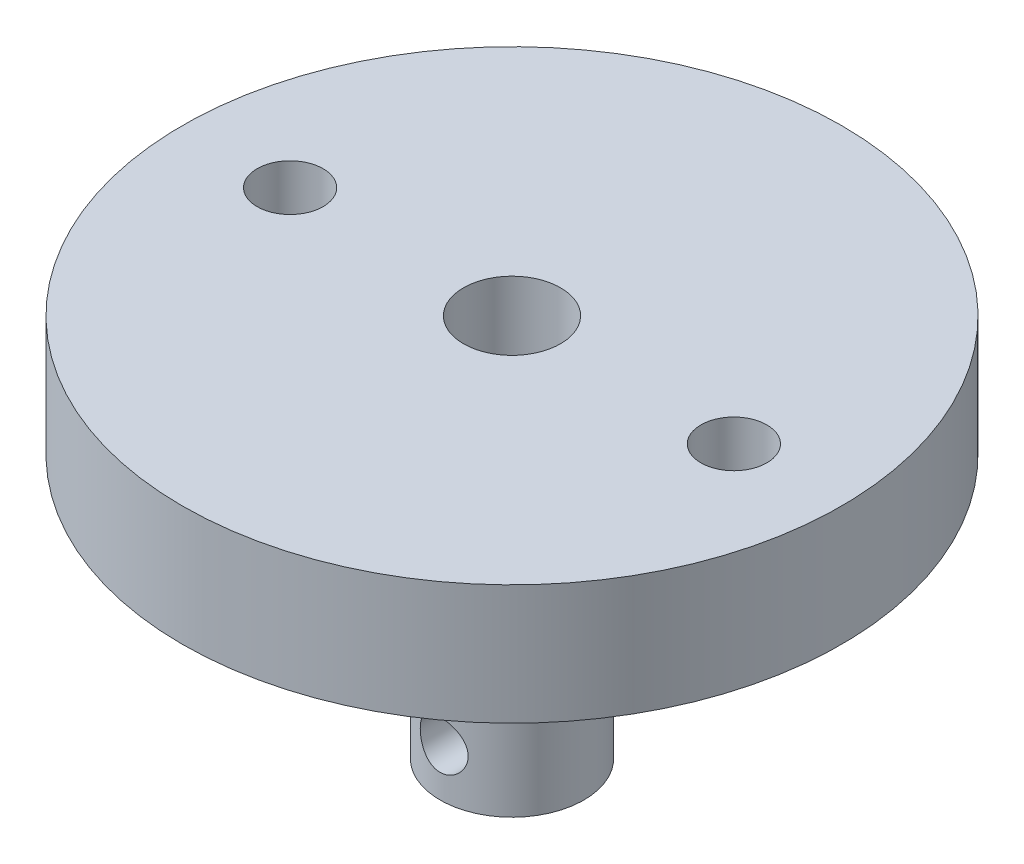
ISO-10303-21;
HEADER;
FILE_DESCRIPTION(('STEP AP214'),'2;1');
FILE_NAME('part.step','',(''),(''),'','','');
FILE_SCHEMA(('AUTOMOTIVE_DESIGN { 1 0 10303 214 1 1 1 1 }'));
ENDSEC;
DATA;
#1=APPLICATION_CONTEXT('core data for automotive mechanical design processes');
#2=APPLICATION_PROTOCOL_DEFINITION('international standard','automotive_design',2000,#1);
#3=PRODUCT_CONTEXT('',#1,'mechanical');
#4=PRODUCT('Part','Part','',(#3));
#5=PRODUCT_RELATED_PRODUCT_CATEGORY('part','',(#4));
#6=PRODUCT_DEFINITION_FORMATION('','',#4);
#7=PRODUCT_DEFINITION_CONTEXT('part definition',#1,'design');
#8=PRODUCT_DEFINITION('design','',#6,#7);
#9=PRODUCT_DEFINITION_SHAPE('','',#8);
#10=(LENGTH_UNIT() NAMED_UNIT(*) SI_UNIT(.MILLI.,.METRE.));
#11=(NAMED_UNIT(*) PLANE_ANGLE_UNIT() SI_UNIT($,.RADIAN.));
#12=(NAMED_UNIT(*) SI_UNIT($,.STERADIAN.) SOLID_ANGLE_UNIT());
#13=UNCERTAINTY_MEASURE_WITH_UNIT(LENGTH_MEASURE(1.E-05),#10,'distance_accuracy_value','');
#14=(GEOMETRIC_REPRESENTATION_CONTEXT(3) GLOBAL_UNCERTAINTY_ASSIGNED_CONTEXT((#13)) GLOBAL_UNIT_ASSIGNED_CONTEXT((#10,
#11,#12)) REPRESENTATION_CONTEXT('',''));
#15=CARTESIAN_POINT('',(0.,0.,0.));
#16=DIRECTION('',(0.,0.,1.));
#17=DIRECTION('',(1.,0.,0.));
#18=AXIS2_PLACEMENT_3D('',#15,#16,#17);
#19=CARTESIAN_POINT('',(0.,10.,0.));
#20=DIRECTION('',(0.,-1.,0.));
#21=DIRECTION('',(0.,0.,-1.));
#22=AXIS2_PLACEMENT_3D('',#19,#20,#21);
#23=CYLINDRICAL_SURFACE('',#22,27.5);
#24=CARTESIAN_POINT('',(0.,10.,0.));
#25=DIRECTION('',(0.,1.,0.));
#26=DIRECTION('',(0.,0.,1.));
#27=AXIS2_PLACEMENT_3D('',#24,#25,#26);
#28=CIRCLE('',#27,27.5);
#29=CARTESIAN_POINT('',(0.,10.,27.5));
#30=VERTEX_POINT('',#29);
#31=EDGE_CURVE('E52',#30,#30,#28,.T.);
#32=ORIENTED_EDGE('',*,*,#31,.F.);
#33=EDGE_LOOP('',(#32));
#34=FACE_BOUND('',#33,.T.);
#35=CARTESIAN_POINT('',(0.,0.,0.));
#36=DIRECTION('',(0.,1.,0.));
#37=DIRECTION('',(0.,0.,1.));
#38=AXIS2_PLACEMENT_3D('',#35,#36,#37);
#39=CIRCLE('',#38,27.5);
#40=CARTESIAN_POINT('',(0.,0.,27.5));
#41=VERTEX_POINT('',#40);
#42=EDGE_CURVE('E59',#41,#41,#39,.T.);
#43=ORIENTED_EDGE('',*,*,#42,.T.);
#44=EDGE_LOOP('',(#43));
#45=FACE_BOUND('',#44,.T.);
#46=ADVANCED_FACE('F41',(#34,#45),#23,.T.);
#47=CARTESIAN_POINT('',(0.,10.,0.));
#48=DIRECTION('',(0.,1.,0.));
#49=DIRECTION('',(0.,0.,1.));
#50=AXIS2_PLACEMENT_3D('',#47,#48,#49);
#51=PLANE('',#50);
#52=CARTESIAN_POINT('',(0.,10.,0.));
#53=DIRECTION('',(0.,1.,0.));
#54=DIRECTION('',(0.,0.,1.));
#55=AXIS2_PLACEMENT_3D('',#52,#53,#54);
#56=CIRCLE('',#55,4.05);
#57=CARTESIAN_POINT('',(0.,10.,4.05));
#58=VERTEX_POINT('',#57);
#59=EDGE_CURVE('E240',#58,#58,#56,.T.);
#60=ORIENTED_EDGE('',*,*,#59,.F.);
#61=EDGE_LOOP('',(#60));
#62=FACE_BOUND('',#61,.T.);
#63=CARTESIAN_POINT('',(-18.515,10.,0.));
#64=DIRECTION('',(0.,-1.,0.));
#65=DIRECTION('',(0.,0.,1.));
#66=AXIS2_PLACEMENT_3D('',#63,#64,#65);
#67=CIRCLE('',#66,2.75);
#68=CARTESIAN_POINT('',(-18.515,10.,2.75));
#69=VERTEX_POINT('',#68);
#70=EDGE_CURVE('E63',#69,#69,#67,.T.);
#71=ORIENTED_EDGE('',*,*,#70,.T.);
#72=EDGE_LOOP('',(#71));
#73=FACE_BOUND('',#72,.T.);
#74=CARTESIAN_POINT('',(18.515,10.,0.));
#75=DIRECTION('',(0.,-1.,0.));
#76=DIRECTION('',(0.,0.,-1.));
#77=AXIS2_PLACEMENT_3D('',#74,#75,#76);
#78=CIRCLE('',#77,2.75);
#79=CARTESIAN_POINT('',(18.515,10.,-2.75));
#80=VERTEX_POINT('',#79);
#81=EDGE_CURVE('E71',#80,#80,#78,.T.);
#82=ORIENTED_EDGE('',*,*,#81,.T.);
#83=EDGE_LOOP('',(#82));
#84=FACE_BOUND('',#83,.T.);
#85=ORIENTED_EDGE('',*,*,#31,.T.);
#86=EDGE_LOOP('',(#85));
#87=FACE_BOUND('',#86,.T.);
#88=ADVANCED_FACE('F129',(#62,#73,#84,#87),#51,.T.);
#89=CARTESIAN_POINT('',(0.,0.,0.));
#90=DIRECTION('',(0.,1.,0.));
#91=DIRECTION('',(0.,0.,1.));
#92=AXIS2_PLACEMENT_3D('',#89,#90,#91);
#93=PLANE('',#92);
#94=CARTESIAN_POINT('',(0.,0.,0.));
#95=DIRECTION('',(0.,-1.,0.));
#96=DIRECTION('',(0.,0.,-1.));
#97=AXIS2_PLACEMENT_3D('',#94,#95,#96);
#98=CIRCLE('',#97,6.);
#99=CARTESIAN_POINT('',(0.,0.,-6.));
#100=VERTEX_POINT('',#99);
#101=EDGE_CURVE('E10',#100,#100,#98,.T.);
#102=ORIENTED_EDGE('',*,*,#101,.F.);
#103=EDGE_LOOP('',(#102));
#104=FACE_BOUND('',#103,.T.);
#105=CARTESIAN_POINT('',(-18.515,0.,0.));
#106=DIRECTION('',(0.,-1.,0.));
#107=DIRECTION('',(0.,0.,1.));
#108=AXIS2_PLACEMENT_3D('',#105,#106,#107);
#109=CIRCLE('',#108,2.75);
#110=CARTESIAN_POINT('',(-18.515,0.,2.75));
#111=VERTEX_POINT('',#110);
#112=EDGE_CURVE('E70',#111,#111,#109,.T.);
#113=ORIENTED_EDGE('',*,*,#112,.F.);
#114=EDGE_LOOP('',(#113));
#115=FACE_BOUND('',#114,.T.);
#116=CARTESIAN_POINT('',(18.515,0.,0.));
#117=DIRECTION('',(0.,-1.,0.));
#118=DIRECTION('',(0.,0.,-1.));
#119=AXIS2_PLACEMENT_3D('',#116,#117,#118);
#120=CIRCLE('',#119,2.75);
#121=CARTESIAN_POINT('',(18.515,0.,-2.75));
#122=VERTEX_POINT('',#121);
#123=EDGE_CURVE('E69',#122,#122,#120,.T.);
#124=ORIENTED_EDGE('',*,*,#123,.F.);
#125=EDGE_LOOP('',(#124));
#126=FACE_BOUND('',#125,.T.);
#127=ORIENTED_EDGE('',*,*,#42,.F.);
#128=EDGE_LOOP('',(#127));
#129=FACE_BOUND('',#128,.T.);
#130=ADVANCED_FACE('F121',(#104,#115,#126,#129),#93,.F.);
#131=CARTESIAN_POINT('',(18.515,10.,0.));
#132=DIRECTION('',(0.,-1.,0.));
#133=DIRECTION('',(0.,0.,-1.));
#134=AXIS2_PLACEMENT_3D('',#131,#132,#133);
#135=CYLINDRICAL_SURFACE('',#134,2.75);
#136=ORIENTED_EDGE('',*,*,#81,.F.);
#137=EDGE_LOOP('',(#136));
#138=FACE_BOUND('',#137,.T.);
#139=ORIENTED_EDGE('',*,*,#123,.T.);
#140=EDGE_LOOP('',(#139));
#141=FACE_BOUND('',#140,.T.);
#142=ADVANCED_FACE('F119',(#138,#141),#135,.F.);
#143=CARTESIAN_POINT('',(-18.515,10.,0.));
#144=DIRECTION('',(0.,-1.,0.));
#145=DIRECTION('',(0.,0.,1.));
#146=AXIS2_PLACEMENT_3D('',#143,#144,#145);
#147=CYLINDRICAL_SURFACE('',#146,2.75);
#148=ORIENTED_EDGE('',*,*,#70,.F.);
#149=EDGE_LOOP('',(#148));
#150=FACE_BOUND('',#149,.T.);
#151=ORIENTED_EDGE('',*,*,#112,.T.);
#152=EDGE_LOOP('',(#151));
#153=FACE_BOUND('',#152,.T.);
#154=ADVANCED_FACE('F114',(#150,#153),#147,.F.);
#155=CARTESIAN_POINT('',(0.,-22.,0.));
#156=DIRECTION('',(0.,1.,0.));
#157=DIRECTION('',(0.,0.,1.));
#158=AXIS2_PLACEMENT_3D('',#155,#156,#157);
#159=CYLINDRICAL_SURFACE('',#158,6.);
#160=CARTESIAN_POINT('',(0.,-20.,6.));
#161=CARTESIAN_POINT('',(-0.109126725773447,-20.0000005074633,6.00000030601888));
#162=CARTESIAN_POINT('',(-0.2182503890771,-19.9910394677456,5.9969953901509));
#163=CARTESIAN_POINT('',(-0.433283521745945,-19.9555417823656,5.98530420406562));
#164=CARTESIAN_POINT('',(-0.539192656237636,-19.9290033121022,5.97661734404305));
#165=CARTESIAN_POINT('',(-0.744665579003553,-19.8593615132319,5.95450615812885));
#166=CARTESIAN_POINT('',(-0.844239651772069,-19.8162858750815,5.94108975461707));
#167=CARTESIAN_POINT('',(-1.03474987361065,-19.7149176543233,5.91088891434684));
#168=CARTESIAN_POINT('',(-1.12568431391741,-19.6566220699948,5.89410381335556));
#169=CARTESIAN_POINT('',(-1.29948335004453,-19.5243483902825,5.8582818888601));
#170=CARTESIAN_POINT('',(-1.38200740059662,-19.449937531479,5.8391911292757));
#171=CARTESIAN_POINT('',(-1.53366538540417,-19.2884656905869,5.80120629566243));
#172=CARTESIAN_POINT('',(-1.60279637097893,-19.201401930143,5.78231226581098));
#173=CARTESIAN_POINT('',(-1.72764988445572,-19.0140297696071,5.74626664954548));
#174=CARTESIAN_POINT('',(-1.78292971644207,-18.9134125205358,5.72918078551376));
#175=CARTESIAN_POINT('',(-1.87563774775544,-18.7036478110829,5.69950610837202));
#176=CARTESIAN_POINT('',(-1.91307139477353,-18.5945029656745,5.68691592321491));
#177=CARTESIAN_POINT('',(-1.96774692301833,-18.3746535570066,5.66822606538755));
#178=CARTESIAN_POINT('',(-1.98562689654354,-18.2641255830219,5.66192191539223));
#179=CARTESIAN_POINT('',(-2.00268224666896,-18.0414724916882,5.65591313259015));
#180=CARTESIAN_POINT('',(-2.00186340320944,-17.9293478785816,5.6562064604546));
#181=CARTESIAN_POINT('',(-1.98203980740684,-17.712126739112,5.6631803001636));
#182=CARTESIAN_POINT('',(-1.96386782633399,-17.606943194162,5.66956831735066));
#183=CARTESIAN_POINT('',(-1.91121232569884,-17.4012131607863,5.68753315449102));
#184=CARTESIAN_POINT('',(-1.87672685318374,-17.3006672291299,5.69911059568215));
#185=CARTESIAN_POINT('',(-1.79187811612042,-17.105174500817,5.72635822262498));
#186=CARTESIAN_POINT('',(-1.74126809741452,-17.0103439490609,5.74209131586235));
#187=CARTESIAN_POINT('',(-1.62577821260628,-16.8302581834405,5.77585117151453));
#188=CARTESIAN_POINT('',(-1.56089422472801,-16.7450057461332,5.79387859580927));
#189=CARTESIAN_POINT('',(-1.41469866536448,-16.5818168036784,5.83134658335482));
#190=CARTESIAN_POINT('',(-1.33270630015262,-16.5044946109819,5.85081178709686));
#191=CARTESIAN_POINT('',(-1.15667913994013,-16.3645374666732,5.88813876774073));
#192=CARTESIAN_POINT('',(-1.06264319132163,-16.301903923671,5.90600039076135));
#193=CARTESIAN_POINT('',(-0.863895226092536,-16.1926073995299,5.93834215875587));
#194=CARTESIAN_POINT('',(-0.759086552832674,-16.1461090173185,5.95278700016078));
#195=CARTESIAN_POINT('',(-0.542538166729015,-16.0715936520886,5.9764113428887));
#196=CARTESIAN_POINT('',(-0.430800876309906,-16.0435702491531,5.98559267309759));
#197=CARTESIAN_POINT('',(-0.208767659058607,-16.0078886679553,5.99735254142881));
#198=CARTESIAN_POINT('',(-0.0986191997296913,-15.9994003816545,6.00020003667456));
#199=CARTESIAN_POINT('',(0.121550139920475,-16.0006653471969,5.99977805389655));
#200=CARTESIAN_POINT('',(0.231571038639301,-16.0104155199597,5.99650960838725));
#201=CARTESIAN_POINT('',(0.445039732608512,-16.0472238154719,5.98440049434209));
#202=CARTESIAN_POINT('',(0.548585613669688,-16.073772412099,5.97572397422385));
#203=CARTESIAN_POINT('',(0.749711917159148,-16.1427868889335,5.9538369366014));
#204=CARTESIAN_POINT('',(0.847291577017214,-16.1852547989356,5.9406258409335));
#205=CARTESIAN_POINT('',(1.03657659278655,-16.2861408636816,5.91057862574579));
#206=CARTESIAN_POINT('',(1.12805991843429,-16.3449491865663,5.89365629511572));
#207=CARTESIAN_POINT('',(1.30012966027117,-16.476388300027,5.85810507832525));
#208=CARTESIAN_POINT('',(1.38071273559115,-16.5490233120635,5.83947567187655));
#209=CARTESIAN_POINT('',(1.5325050156126,-16.7099575020132,5.80153695960889));
#210=CARTESIAN_POINT('',(1.60312193849154,-16.7988184538537,5.78223522174856));
#211=CARTESIAN_POINT('',(1.72851504464715,-16.9875431356218,5.74599946589417));
#212=CARTESIAN_POINT('',(1.78329109586203,-17.0874069572682,5.72906546764005));
#213=CARTESIAN_POINT('',(1.87519386083272,-17.2953460305798,5.69964783582767));
#214=CARTESIAN_POINT('',(1.91235626433004,-17.4034041583375,5.68715521585958));
#215=CARTESIAN_POINT('',(1.96778933351871,-17.6247573000883,5.66821664612899));
#216=CARTESIAN_POINT('',(1.98606850990788,-17.7380499308087,5.66176797247279));
#217=CARTESIAN_POINT('',(2.00255256495469,-17.9603941920818,5.65595717748354));
#218=CARTESIAN_POINT('',(2.0017405146168,-18.0693646805736,5.6562480051483));
#219=CARTESIAN_POINT('',(1.98248458689739,-18.2855301498441,5.66302539647735));
#220=CARTESIAN_POINT('',(1.96404175891717,-18.3927252359102,5.66951159138723));
#221=CARTESIAN_POINT('',(1.91074362625869,-18.6002713260049,5.68769048609783));
#222=CARTESIAN_POINT('',(1.87620669203103,-18.700713650009,5.69928196044955));
#223=CARTESIAN_POINT('',(1.7919587315195,-18.8944548138765,5.72632797636937));
#224=CARTESIAN_POINT('',(1.74224433710761,-18.987752062376,5.74178337526786));
#225=CARTESIAN_POINT('',(1.62652138516686,-19.1689673398458,5.77565658452093));
#226=CARTESIAN_POINT('',(1.55989648552916,-19.2564730037968,5.79417423284274));
#227=CARTESIAN_POINT('',(1.4132857662713,-19.4193796267684,5.83166712566506));
#228=CARTESIAN_POINT('',(1.33329616890296,-19.4947771513761,5.85064249824745));
#229=CARTESIAN_POINT('',(1.15848311384138,-19.6342888245784,5.88780061051088));
#230=CARTESIAN_POINT('',(1.06320302699946,-19.697848695502,5.90592363602513));
#231=CARTESIAN_POINT('',(0.862714714813251,-19.8079808577013,5.93851982345224));
#232=CARTESIAN_POINT('',(0.757509036264699,-19.8545574918441,5.9529939181586));
#233=CARTESIAN_POINT('',(0.544987294401953,-19.9274432649773,5.97611030137084));
#234=CARTESIAN_POINT('',(0.437975515352818,-19.9545649325268,5.98498424845045));
#235=CARTESIAN_POINT('',(0.220640832020494,-19.9908405613543,5.99692814128444));
#236=CARTESIAN_POINT('',(0.110318851137493,-19.9999994869931,5.9999996906381));
#237=CARTESIAN_POINT('',(0.,-20.,6.));
#238=B_SPLINE_CURVE_WITH_KNOTS('',3,(#160,#161,#162,#163,#164,#165,#166,#167,#168,#169,#170,
#171,#172,#173,#174,#175,#176,#177,#178,#179,#180,#181,#182,#183,#184,#185,#186,#187,#188,#189,
#190,#191,#192,#193,#194,#195,#196,#197,#198,#199,#200,#201,#202,#203,#204,#205,#206,#207,#208,
#209,#210,#211,#212,#213,#214,#215,#216,#217,#218,#219,#220,#221,#222,#223,#224,#225,#226,#227,
#228,#229,#230,#231,#232,#233,#234,#235,#236,#237),.UNSPECIFIED.,.T.,.F.,(4,2,2,2,2,2,2,2,2,2,2,
2,2,2,2,2,2,2,2,2,2,2,2,2,2,2,2,2,2,2,2,2,2,2,2,2,2,2,4),(0.,0.326974212052023,
0.653982370535042,0.980445345740548,1.3069727555982,1.64369368565512,1.9804886657506,
2.32696769646941,2.67334089385667,3.0080385148368,3.34263267974971,3.66193653102561,
3.98127861710965,4.30576342310262,4.63034205116415,4.97186611622734,5.31342291933237,
5.65836811300716,6.00319337754417,6.3330716635034,6.66289426328354,6.98316315956427,
7.30347290568208,7.63220799687474,7.96104361643783,8.30482045761505,8.64860016469994,
8.99168027653541,9.33460569411681,9.65991332128517,9.98520158702751,10.3043117416084,
10.6234927635196,10.9566013338361,11.2898042224756,11.635993216702,11.9820936230491,
12.3127311674763,12.6432773207628),.UNSPECIFIED.);
#239=CARTESIAN_POINT('',(0.,-20.,6.));
#240=VERTEX_POINT('',#239);
#241=EDGE_CURVE('E102',#240,#240,#238,.T.);
#242=ORIENTED_EDGE('',*,*,#241,.T.);
#243=EDGE_LOOP('',(#242));
#244=FACE_BOUND('',#243,.T.);
#245=CARTESIAN_POINT('',(2.,-18.,-5.65685424949238));
#246=CARTESIAN_POINT('',(2.00000051589543,-17.8910636503279,-5.65685389060868));
#247=CARTESIAN_POINT('',(1.99106956737105,-17.7821304003528,-5.66003538581715));
#248=CARTESIAN_POINT('',(1.95570226337762,-17.5674911580115,-5.6723514816251));
#249=CARTESIAN_POINT('',(1.9292630243368,-17.4617857002551,-5.68148706284377));
#250=CARTESIAN_POINT('',(1.85991097136981,-17.2567462140054,-5.70456407377583));
#251=CARTESIAN_POINT('',(1.81703044280649,-17.1574001411146,-5.71849607942644));
#252=CARTESIAN_POINT('',(1.71612325688277,-16.9672799029041,-5.74958244020649));
#253=CARTESIAN_POINT('',(1.65809325772037,-16.8765076348927,-5.76673750607225));
#254=CARTESIAN_POINT('',(1.52610229288576,-16.7025600753234,-5.80308978814946));
#255=CARTESIAN_POINT('',(1.45164868275584,-16.6197691426565,-5.82233789689288));
#256=CARTESIAN_POINT('',(1.28997533442879,-16.4675863975507,-5.86027729602006));
#257=CARTESIAN_POINT('',(1.20275355010475,-16.3981967368353,-5.87896849657923));
#258=CARTESIAN_POINT('',(1.01520901593002,-16.2730422053408,-5.91427733843598));
#259=CARTESIAN_POINT('',(0.914603822449053,-16.2176800587641,-5.93082815403211));
#260=CARTESIAN_POINT('',(0.70486244597495,-16.124816829745,-5.95939173541966));
#261=CARTESIAN_POINT('',(0.595728571374426,-16.0873109336462,-5.97140572406004));
#262=CARTESIAN_POINT('',(0.37605763486699,-16.0325282907352,-5.98918150863813));
#263=CARTESIAN_POINT('',(0.265701509705938,-16.014593107486,-5.99514629555118));
#264=CARTESIAN_POINT('',(0.0433957496481793,-15.9973674132787,-6.00087216436496));
#265=CARTESIAN_POINT('',(-0.0685534670877928,-15.9980720966952,-6.00063484525791));
#266=CARTESIAN_POINT('',(-0.28620703038763,-16.0176885091321,-5.99412079237463));
#267=CARTESIAN_POINT('',(-0.391984097183313,-16.035885056949,-5.98808129510235));
#268=CARTESIAN_POINT('',(-0.598886877644344,-16.0887859619609,-5.97093934679463));
#269=CARTESIAN_POINT('',(-0.700012275558432,-16.1234914379596,-5.95983655262364));
#270=CARTESIAN_POINT('',(-0.896304949683946,-16.2088426346121,-5.93351340586448));
#271=CARTESIAN_POINT('',(-0.99137644193769,-16.259691877093,-5.91824085048031));
#272=CARTESIAN_POINT('',(-1.17184865105464,-16.3757194108973,-5.88516786077838));
#273=CARTESIAN_POINT('',(-1.25724666877068,-16.4409016866553,-5.86736672402934));
#274=CARTESIAN_POINT('',(-1.42020173310262,-16.5873487869194,-5.83012383699793));
#275=CARTESIAN_POINT('',(-1.49720031413054,-16.669226315683,-5.81064430337755));
#276=CARTESIAN_POINT('',(-1.63655451919635,-16.8448974514532,-5.77294670497801));
#277=CARTESIAN_POINT('',(-1.69890788656309,-16.9386928914561,-5.75472883491231));
#278=CARTESIAN_POINT('',(-1.80797491007149,-17.1373072512069,-5.72141050242225));
#279=CARTESIAN_POINT('',(-1.85445292724268,-17.2422642626355,-5.70635818569496));
#280=CARTESIAN_POINT('',(-1.92888638653867,-17.4591427884288,-5.6816330164877));
#281=CARTESIAN_POINT('',(-1.95684959149499,-17.5710613624125,-5.67195790974185));
#282=CARTESIAN_POINT('',(-1.99232256419504,-17.7932767108231,-5.6595927263117));
#283=CARTESIAN_POINT('',(-2.00069819101527,-17.9034188494973,-5.65660720637512));
#284=CARTESIAN_POINT('',(-1.99921087781944,-18.1235522982282,-5.65713344118369));
#285=CARTESIAN_POINT('',(-1.98935125045353,-18.233543632048,-5.66064401583629));
#286=CARTESIAN_POINT('',(-1.95245130310462,-18.4463139314238,-5.67347236180599));
#287=CARTESIAN_POINT('',(-1.92601278796137,-18.5492108603017,-5.68258650881681));
#288=CARTESIAN_POINT('',(-1.85742772512094,-18.7490872124784,-5.70537107342046));
#289=CARTESIAN_POINT('',(-1.81527839272685,-18.8460655831816,-5.71904229869679));
#290=CARTESIAN_POINT('',(-1.71494868147788,-19.034760841694,-5.74993755191574));
#291=CARTESIAN_POINT('',(-1.656302236717,-19.1262132852836,-5.76726051331257));
#292=CARTESIAN_POINT('',(-1.52517126111512,-19.2982921047674,-5.8033153746193));
#293=CARTESIAN_POINT('',(-1.45268265099757,-19.3789152773224,-5.82204768887589));
#294=CARTESIAN_POINT('',(-1.29178341180065,-19.5310559681813,-5.85990077275698));
#295=CARTESIAN_POINT('',(-1.20277454109331,-19.6019487800377,-5.87899687155793));
#296=CARTESIAN_POINT('',(-1.01365458280052,-19.7278322846961,-5.91453703226218));
#297=CARTESIAN_POINT('',(-0.913543889729107,-19.7828235423248,-5.9309811883539));
#298=CARTESIAN_POINT('',(-0.705559724864593,-19.8748402097234,-5.95928811621206));
#299=CARTESIAN_POINT('',(-0.597742246642395,-19.9119825542961,-5.97118060009062));
#300=CARTESIAN_POINT('',(-0.376916931692034,-19.9674554841202,-5.98917221675549));
#301=CARTESIAN_POINT('',(-0.263910983907779,-19.985792859761,-5.99527344068038));
#302=CARTESIAN_POINT('',(-0.0416306717200822,-20.0025241552113,-6.00083726472513));
#303=CARTESIAN_POINT('',(0.0675694478400367,-20.0018149078648,-6.00059840178878));
#304=CARTESIAN_POINT('',(0.284222290000348,-19.9826853837072,-5.99424393038796));
#305=CARTESIAN_POINT('',(0.391675153638114,-19.9642665436945,-5.98812879867152));
#306=CARTESIAN_POINT('',(0.600084238864118,-19.9108355308481,-5.97081829908825));
#307=CARTESIAN_POINT('',(0.701116541825578,-19.8760915692941,-5.95970516722297));
#308=CARTESIAN_POINT('',(0.895956701879591,-19.7912449378057,-5.9335432140899));
#309=CARTESIAN_POINT('',(0.989763248284865,-19.741139489606,-5.91849368096033));
#310=CARTESIAN_POINT('',(1.17126803261757,-19.624860975796,-5.88531737655762));
#311=CARTESIAN_POINT('',(1.25861250311522,-19.5581626292367,-5.86709744983853));
#312=CARTESIAN_POINT('',(1.42116205254486,-19.4114852176876,-5.82985977583759));
#313=CARTESIAN_POINT('',(1.49636324324919,-19.3315019154745,-5.81084177546194));
#314=CARTESIAN_POINT('',(1.63548361766624,-19.1567812888261,-5.77326559651196));
#315=CARTESIAN_POINT('',(1.6988459319958,-19.0615889780467,-5.75475455977261));
#316=CARTESIAN_POINT('',(1.80862868660223,-18.8613311461944,-5.72120386646031));
#317=CARTESIAN_POINT('',(1.85505355363895,-18.7562682139407,-5.70616330322499));
#318=CARTESIAN_POINT('',(1.92768765640833,-18.5440763519687,-5.68202668413029));
#319=CARTESIAN_POINT('',(1.95471581829904,-18.4372554729493,-5.67269265714364));
#320=CARTESIAN_POINT('',(1.99086864029854,-18.2202878990666,-5.66010767079036));
#321=CARTESIAN_POINT('',(1.99999947839319,-18.1101423651786,-5.65685461234922));
#322=CARTESIAN_POINT('',(2.,-18.,-5.65685424949238));
#323=B_SPLINE_CURVE_WITH_KNOTS('',3,(#245,#246,#247,#248,#249,#250,#251,#252,#253,#254,#255,
#256,#257,#258,#259,#260,#261,#262,#263,#264,#265,#266,#267,#268,#269,#270,#271,#272,#273,#274,
#275,#276,#277,#278,#279,#280,#281,#282,#283,#284,#285,#286,#287,#288,#289,#290,#291,#292,#293,
#294,#295,#296,#297,#298,#299,#300,#301,#302,#303,#304,#305,#306,#307,#308,#309,#310,#311,#312,
#313,#314,#315,#316,#317,#318,#319,#320,#321,#322),.UNSPECIFIED.,.T.,.F.,(4,2,2,2,2,2,2,2,2,2,2,
2,2,2,2,2,2,2,2,2,2,2,2,2,2,2,2,2,2,2,2,2,2,2,2,2,2,2,4),(0.,0.326401169598711,
0.652856110030327,0.978673255001652,1.30456233237088,1.64202674855136,1.97954530343976,
2.32587012287314,2.67210152773578,3.00628637529869,3.34038506604655,3.66138009651138,
3.98239688378474,4.3076330972067,4.63295983748044,4.97360348727836,5.31429959224212,
5.65985279686111,6.00526102713232,6.3350858272888,6.66485071674468,6.98328791537553,
7.30178158293892,7.6303771547143,7.95906971324255,8.30357616342186,8.64807037515065,
8.99027582381704,9.33235766008314,9.65836169355272,9.98433928019563,10.3051391208086,
10.6259970152649,10.9587103904127,11.2915300886526,11.6373780547229,11.9831355653373,
12.3132642432538,12.6432789438093),.UNSPECIFIED.);
#324=CARTESIAN_POINT('',(2.,-18.,-5.65685424949238));
#325=VERTEX_POINT('',#324);
#326=EDGE_CURVE('E100',#325,#325,#323,.T.);
#327=ORIENTED_EDGE('',*,*,#326,.T.);
#328=EDGE_LOOP('',(#327));
#329=FACE_BOUND('',#328,.T.);
#330=CARTESIAN_POINT('',(0.,-22.,0.));
#331=DIRECTION('',(0.,-1.,0.));
#332=DIRECTION('',(0.,0.,-1.));
#333=AXIS2_PLACEMENT_3D('',#330,#331,#332);
#334=CIRCLE('',#333,6.);
#335=CARTESIAN_POINT('',(0.,-22.,-6.));
#336=VERTEX_POINT('',#335);
#337=EDGE_CURVE('E61',#336,#336,#334,.T.);
#338=ORIENTED_EDGE('',*,*,#337,.F.);
#339=EDGE_LOOP('',(#338));
#340=FACE_BOUND('',#339,.T.);
#341=ORIENTED_EDGE('',*,*,#101,.T.);
#342=EDGE_LOOP('',(#341));
#343=FACE_BOUND('',#342,.T.);
#344=ADVANCED_FACE('F109',(#244,#329,#340,#343),#159,.T.);
#345=CARTESIAN_POINT('',(0.,-22.,0.));
#346=DIRECTION('',(0.,-1.,0.));
#347=DIRECTION('',(0.,0.,-1.));
#348=AXIS2_PLACEMENT_3D('',#345,#346,#347);
#349=PLANE('',#348);
#350=CARTESIAN_POINT('',(0.,-22.,0.));
#351=DIRECTION('',(0.,-1.,0.));
#352=DIRECTION('',(0.,0.,-1.));
#353=AXIS2_PLACEMENT_3D('',#350,#351,#352);
#354=CIRCLE('',#353,3.15);
#355=CARTESIAN_POINT('',(0.,-22.,-3.15));
#356=VERTEX_POINT('',#355);
#357=EDGE_CURVE('E233',#356,#356,#354,.T.);
#358=ORIENTED_EDGE('',*,*,#357,.F.);
#359=EDGE_LOOP('',(#358));
#360=FACE_BOUND('',#359,.T.);
#361=ORIENTED_EDGE('',*,*,#337,.T.);
#362=EDGE_LOOP('',(#361));
#363=FACE_BOUND('',#362,.T.);
#364=ADVANCED_FACE('F112',(#360,#363),#349,.T.);
#365=CARTESIAN_POINT('',(0.,-10.,0.));
#366=DIRECTION('',(0.,-1.,0.));
#367=DIRECTION('',(0.,0.,-1.));
#368=AXIS2_PLACEMENT_3D('',#365,#366,#367);
#369=CYLINDRICAL_SURFACE('',#368,3.15);
#370=CARTESIAN_POINT('',(0.,-16.,-3.15));
#371=CARTESIAN_POINT('',(0.101328295299759,-16.0000084654744,-3.1499922119599));
#372=CARTESIAN_POINT('',(0.202770915460729,-16.0077530423655,-3.14505982105238));
#373=CARTESIAN_POINT('',(0.402524100663891,-16.0383099232075,-3.12579483351825));
#374=CARTESIAN_POINT('',(0.500828823157442,-16.0611487909114,-3.11144566504826));
#375=CARTESIAN_POINT('',(0.691032534438774,-16.1205444210241,-3.07478636281983));
#376=CARTESIAN_POINT('',(0.782960723558891,-16.1570329751302,-3.05251583931343));
#377=CARTESIAN_POINT('',(0.959055763109467,-16.2422200803758,-3.00185271227445));
#378=CARTESIAN_POINT('',(1.04322323081538,-16.2909176592811,-2.97346059624432));
#379=CARTESIAN_POINT('',(1.20913129890193,-16.4034869633182,-2.91015620480417));
#380=CARTESIAN_POINT('',(1.29012087942114,-16.4682692951188,-2.87490181233013));
#381=CARTESIAN_POINT('',(1.44081134156069,-16.6090591112678,-2.8024223154422));
#382=CARTESIAN_POINT('',(1.51049646422323,-16.6850819882063,-2.76519455430196));
#383=CARTESIAN_POINT('',(1.6465869454788,-16.8586938095558,-2.68667917095263));
#384=CARTESIAN_POINT('',(1.71115232674168,-16.9578121057732,-2.64555702324946));
#385=CARTESIAN_POINT('',(1.82254172327958,-17.1678862812733,-2.57009310961413));
#386=CARTESIAN_POINT('',(1.86939604232566,-17.2788215208403,-2.53573981079963));
#387=CARTESIAN_POINT('',(1.9331124860784,-17.4794155522189,-2.48731435162753));
#388=CARTESIAN_POINT('',(1.9546390306579,-17.5668716745577,-2.47027743129935));
#389=CARTESIAN_POINT('',(1.985744692257,-17.7451049334412,-2.44534827423124));
#390=CARTESIAN_POINT('',(1.99534152128663,-17.8358769401306,-2.43744248177518));
#391=CARTESIAN_POINT('',(2.00200580970024,-18.0184715111386,-2.43197374033438));
#392=CARTESIAN_POINT('',(1.99903661212385,-18.1102963686877,-2.43444105108947));
#393=CARTESIAN_POINT('',(1.98069242429456,-18.2918936573635,-2.44938498790636));
#394=CARTESIAN_POINT('',(1.96530728972028,-18.3816643484529,-2.46186979862181));
#395=CARTESIAN_POINT('',(1.92362494443471,-18.5543972996455,-2.49456111605764));
#396=CARTESIAN_POINT('',(1.89763763834989,-18.6374786119121,-2.51454713057023));
#397=CARTESIAN_POINT('',(1.83581675286623,-18.7982505810684,-2.56002854841375));
#398=CARTESIAN_POINT('',(1.79997988109774,-18.8759394245467,-2.58552579334899));
#399=CARTESIAN_POINT('',(1.71161206434645,-19.0395203130872,-2.64503877464181));
#400=CARTESIAN_POINT('',(1.65719941374378,-19.1241414015515,-2.67975117242556));
#401=CARTESIAN_POINT('',(1.53667431056736,-19.2840053255159,-2.75064205955732));
#402=CARTESIAN_POINT('',(1.47054815402372,-19.3592369983981,-2.78682222744571));
#403=CARTESIAN_POINT('',(1.31474282253611,-19.511732431938,-2.86404945049995));
#404=CARTESIAN_POINT('',(1.22296652919651,-19.5870124578018,-2.90482881650202));
#405=CARTESIAN_POINT('',(1.02578897240499,-19.7210230289447,-2.9801604584375));
#406=CARTESIAN_POINT('',(0.920402688116175,-19.7797715461248,-3.01471948184318));
#407=CARTESIAN_POINT('',(0.720391274999675,-19.8682924322187,-3.06790379468235));
#408=CARTESIAN_POINT('',(0.627764149170645,-19.9014983749803,-3.08832890408521));
#409=CARTESIAN_POINT('',(0.437296666335724,-19.9541008637297,-3.12099034181731));
#410=CARTESIAN_POINT('',(0.339460516161508,-19.9735083768764,-3.13323317305486));
#411=CARTESIAN_POINT('',(0.140937310278005,-19.9975390930733,-3.14842409235442));
#412=CARTESIAN_POINT('',(0.0402421957330327,-20.002115204019,-3.15134257367856));
#413=CARTESIAN_POINT('',(-0.160510837001255,-19.9960763188937,-3.14750934186526));
#414=CARTESIAN_POINT('',(-0.260568704283584,-19.9854601240916,-3.14075686565217));
#415=CARTESIAN_POINT('',(-0.452013881934729,-19.9505594189189,-3.11881571631668));
#416=CARTESIAN_POINT('',(-0.543584449244575,-19.9269862477885,-3.10406658969379));
#417=CARTESIAN_POINT('',(-0.721249770435113,-19.8677725586857,-3.06765880924322));
#418=CARTESIAN_POINT('',(-0.807343597203607,-19.83213000401,-3.04599898927472));
#419=CARTESIAN_POINT('',(-0.97886464984859,-19.7469076302336,-2.99548292158867));
#420=CARTESIAN_POINT('',(-1.06373879157256,-19.6964712758944,-2.96620339848092));
#421=CARTESIAN_POINT('',(-1.22424711836273,-19.5845530302446,-2.90364502354623));
#422=CARTESIAN_POINT('',(-1.29987378342648,-19.5230622485809,-2.8703629599225));
#423=CARTESIAN_POINT('',(-1.45173484279485,-19.3801886816161,-2.79698103870603));
#424=CARTESIAN_POINT('',(-1.52633506925127,-19.2972041619811,-2.75661078721105));
#425=CARTESIAN_POINT('',(-1.66109675817322,-19.1194626221555,-2.67756609117076));
#426=CARTESIAN_POINT('',(-1.72125662920915,-19.0247043061538,-2.63889183391956));
#427=CARTESIAN_POINT('',(-1.81808752363778,-18.8389773386234,-2.57293343354397));
#428=CARTESIAN_POINT('',(-1.85689301040771,-18.749426148282,-2.54481108220561));
#429=CARTESIAN_POINT('',(-1.92141342608016,-18.563738174638,-2.4964586427782));
#430=CARTESIAN_POINT('',(-1.94714684010752,-18.4676109101593,-2.47621741956022));
#431=CARTESIAN_POINT('',(-1.98425879435084,-18.2699866364822,-2.44659176112318));
#432=CARTESIAN_POINT('',(-1.99550793631987,-18.1684495492905,-2.43730525288115));
#433=CARTESIAN_POINT('',(-2.00228148361704,-17.9645157536477,-2.43174801667457));
#434=CARTESIAN_POINT('',(-1.99781502979906,-17.8621195794454,-2.43546972257522));
#435=CARTESIAN_POINT('',(-1.97524023720774,-17.6741857002194,-2.45378847110546));
#436=CARTESIAN_POINT('',(-1.95906584995949,-17.5882462425381,-2.4668407969385));
#437=CARTESIAN_POINT('',(-1.91617082089631,-17.4205218156842,-2.50030534021704));
#438=CARTESIAN_POINT('',(-1.88944011408791,-17.3387408957422,-2.52072458008544));
#439=CARTESIAN_POINT('',(-1.81552138398037,-17.1532385560268,-2.57470796580902));
#440=CARTESIAN_POINT('',(-1.76445755742971,-17.051675682487,-2.61037686673208));
#441=CARTESIAN_POINT('',(-1.64692861977478,-16.8596777608671,-2.68607896448176));
#442=CARTESIAN_POINT('',(-1.58044290030136,-16.7692578529979,-2.72611796285031));
#443=CARTESIAN_POINT('',(-1.43255783764901,-16.5998054932504,-2.80667764737488));
#444=CARTESIAN_POINT('',(-1.35100408709322,-16.5209076575096,-2.84719883419942));
#445=CARTESIAN_POINT('',(-1.17462217989334,-16.3772844891105,-2.92438777254441));
#446=CARTESIAN_POINT('',(-1.07979419534418,-16.3125589727419,-2.96105557401162));
#447=CARTESIAN_POINT('',(-0.87581350158197,-16.1980852888841,-3.02773411520853));
#448=CARTESIAN_POINT('',(-0.766370024244891,-16.1487368187225,-3.05756258736141));
#449=CARTESIAN_POINT('',(-0.59551154889625,-16.0897625870698,-3.0937480981821));
#450=CARTESIAN_POINT('',(-0.537492927402873,-16.0726204068232,-3.10437857417734));
#451=CARTESIAN_POINT('',(-0.419689962218699,-16.0435926616728,-3.12248266835177));
#452=CARTESIAN_POINT('',(-0.35990691399034,-16.0317033376839,-3.12995854387525));
#453=CARTESIAN_POINT('',(-0.250144512469228,-16.0150752820362,-3.14044473612304));
#454=CARTESIAN_POINT('',(-0.200354007096199,-16.0094306578728,-3.14401910724198));
#455=CARTESIAN_POINT('',(-0.100385031706517,-16.0018908603642,-3.14879870603477));
#456=CARTESIAN_POINT('',(-0.0502065494813895,-15.9999958054929,-3.15000385884929));
#457=CARTESIAN_POINT('',(0.,-16.,-3.15));
#458=B_SPLINE_CURVE_WITH_KNOTS('',3,(#370,#371,#372,#373,#374,#375,#376,#377,#378,#379,#380,
#381,#382,#383,#384,#385,#386,#387,#388,#389,#390,#391,#392,#393,#394,#395,#396,#397,#398,#399,
#400,#401,#402,#403,#404,#405,#406,#407,#408,#409,#410,#411,#412,#413,#414,#415,#416,#417,#418,
#419,#420,#421,#422,#423,#424,#425,#426,#427,#428,#429,#430,#431,#432,#433,#434,#435,#436,#437,
#438,#439,#440,#441,#442,#443,#444,#445,#446,#447,#448,#449,#450,#451,#452,#453,#454,#455,#456,
#457),.UNSPECIFIED.,.T.,.F.,(4,2,2,2,2,2,2,2,2,2,2,2,2,2,2,2,2,2,2,2,2,2,2,2,2,2,2,2,2,2,2,2,2,
2,2,2,2,2,2,2,2,2,2,4),(0.,0.303783105715202,0.608102254113063,0.910920585612403,
1.21371481060834,1.54107720414445,1.86889210611638,2.24281615067643,2.6160974806087,
2.88995880481127,3.16341304047501,3.43766553163945,3.71214232528765,3.97911332483881,
4.24617367233591,4.56428730785042,4.88277560179946,5.25746100519583,5.63173748911078,
5.93194170611156,6.23190704961846,6.5328239033662,6.83376450191662,7.11962981752289,
7.40554339683602,7.71329311075238,8.02129144397599,8.37581929029056,8.73038619016791,
9.03392164963643,9.33702667849789,9.6428211880882,9.94843786409287,10.2125720644675,
10.4769587157587,10.8325130897093,11.1885453585804,11.5484517174459,11.9083534107066,
12.2769515997517,12.4609525552843,12.6448216206568,12.7953365345586,12.9458562041492),.UNSPECIFIED.);
#459=CARTESIAN_POINT('',(0.,-16.,-3.15));
#460=VERTEX_POINT('',#459);
#461=EDGE_CURVE('E42',#460,#460,#458,.T.);
#462=ORIENTED_EDGE('',*,*,#461,.T.);
#463=EDGE_LOOP('',(#462));
#464=FACE_BOUND('',#463,.T.);
#465=CARTESIAN_POINT('',(2.,-18.,2.43361870472759));
#466=CARTESIAN_POINT('',(1.99999048596304,-17.9010220758708,2.43363407140303));
#467=CARTESIAN_POINT('',(1.99258494171125,-17.8019062063151,2.4397712297814));
#468=CARTESIAN_POINT('',(1.96350941138464,-17.607062708216,2.46321942053438));
#469=CARTESIAN_POINT('',(1.94180331367139,-17.5113443054949,2.48055873835427));
#470=CARTESIAN_POINT('',(1.88571217682298,-17.3267065694643,2.52345220456699));
#471=CARTESIAN_POINT('',(1.851440143901,-17.237734914472,2.5489328823773));
#472=CARTESIAN_POINT('',(1.77151743183294,-17.0669248818082,2.60511197616351));
#473=CARTESIAN_POINT('',(1.72586583679141,-16.9850870790278,2.6358108120648));
#474=CARTESIAN_POINT('',(1.61708994740565,-16.8183669984535,2.70410628666589));
#475=CARTESIAN_POINT('',(1.55241882997592,-16.7346433549821,2.74206853555775));
#476=CARTESIAN_POINT('',(1.41059220491435,-16.5782456276157,2.81765858361404));
#477=CARTESIAN_POINT('',(1.33342569379183,-16.5055813930957,2.85528605688028));
#478=CARTESIAN_POINT('',(1.15704034741739,-16.3642819209215,2.93157022789516));
#479=CARTESIAN_POINT('',(1.05626802714094,-16.2973078489736,2.96975927399976));
#480=CARTESIAN_POINT('',(0.841996814394424,-16.1818129029096,3.03745228192606));
#481=CARTESIAN_POINT('',(0.728511029226369,-16.1332732459659,3.0669650770146));
#482=CARTESIAN_POINT('',(0.504499180886492,-16.0614865270954,3.11120961521296));
#483=CARTESIAN_POINT('',(0.394895915515058,-16.0361317271435,3.12716069277187));
#484=CARTESIAN_POINT('',(0.171964548656172,-16.0042383287047,3.14728504515542));
#485=CARTESIAN_POINT('',(0.0586406758425451,-15.9976790690635,3.15147125251418));
#486=CARTESIAN_POINT('',(-0.151552365513753,-16.0033706376557,3.1478620369092));
#487=CARTESIAN_POINT('',(-0.248528717658885,-16.0131443838465,3.14164430808859));
#488=CARTESIAN_POINT('',(-0.439138310744909,-16.0464096949478,3.12071260109803));
#489=CARTESIAN_POINT('',(-0.532771299038608,-16.0699022942296,3.10599798228226));
#490=CARTESIAN_POINT('',(-0.714482216536631,-16.1295242353533,3.06930433488698));
#491=CARTESIAN_POINT('',(-0.802553648932609,-16.1656680449304,3.04731699091795));
#492=CARTESIAN_POINT('',(-0.97143370507128,-16.2492282087519,2.9977610791413));
#493=CARTESIAN_POINT('',(-1.05224075549125,-16.2966469968688,2.97019130647403));
#494=CARTESIAN_POINT('',(-1.21525026488542,-16.4081105424623,2.90761365273554));
#495=CARTESIAN_POINT('',(-1.29634063387077,-16.4734985840321,2.87210613999983));
#496=CARTESIAN_POINT('',(-1.44710869319607,-16.6155761615265,2.79917994431847));
#497=CARTESIAN_POINT('',(-1.51676911567106,-16.6922824705496,2.76175847971295));
#498=CARTESIAN_POINT('',(-1.65238450119593,-16.8670889557863,2.68310715916129));
#499=CARTESIAN_POINT('',(-1.71653615599839,-16.9666801753972,2.64205458619123));
#500=CARTESIAN_POINT('',(-1.82699006644229,-17.177673816435,2.56692053853577));
#501=CARTESIAN_POINT('',(-1.87332485499188,-17.2890542322277,2.53282641194835));
#502=CARTESIAN_POINT('',(-1.93594353840381,-17.490067929492,2.48510313895072));
#503=CARTESIAN_POINT('',(-1.95695691453044,-17.5775018242823,2.4684365697313));
#504=CARTESIAN_POINT('',(-1.98705521670472,-17.7555886028806,2.44427838946132));
#505=CARTESIAN_POINT('',(-1.99615746158439,-17.8462366157873,2.43677345842157));
#506=CARTESIAN_POINT('',(-2.00187916764653,-18.0284511190077,2.43207683030032));
#507=CARTESIAN_POINT('',(-1.99846473948858,-18.1200194324677,2.43491313236562));
#508=CARTESIAN_POINT('',(-1.97931399694526,-18.301022543273,2.45050151797388));
#509=CARTESIAN_POINT('',(-1.96356738826233,-18.3904554938213,2.46326188557666));
#510=CARTESIAN_POINT('',(-1.92117762173105,-18.5628335570478,2.4964515411222));
#511=CARTESIAN_POINT('',(-1.89479801639248,-18.6458815055358,2.51669442404587));
#512=CARTESIAN_POINT('',(-1.83219474854383,-18.8065388665811,2.56262885233369));
#513=CARTESIAN_POINT('',(-1.79596764397219,-18.8841463655485,2.58832230217973));
#514=CARTESIAN_POINT('',(-1.70664270614313,-19.0476900692701,2.64826132049625));
#515=CARTESIAN_POINT('',(-1.65163646925487,-19.1323294707201,2.68319953585284));
#516=CARTESIAN_POINT('',(-1.5298767291913,-19.2921238271804,2.75444460515897));
#517=CARTESIAN_POINT('',(-1.4631108044671,-19.3672686076089,2.79075287408715));
#518=CARTESIAN_POINT('',(-1.30608396864552,-19.5192277808985,2.86802362872113));
#519=CARTESIAN_POINT('',(-1.21375656890452,-19.5940759860423,2.90870266544109));
#520=CARTESIAN_POINT('',(-1.01546677917969,-19.7271531963272,2.98371307769469));
#521=CARTESIAN_POINT('',(-0.909509417054117,-19.7853883043913,3.01804678258841));
#522=CARTESIAN_POINT('',(-0.692269340715501,-19.8799012852979,3.07492813370973));
#523=CARTESIAN_POINT('',(-0.581566442490215,-19.9171792501716,3.09800396720935));
#524=CARTESIAN_POINT('',(-0.353649402796514,-19.9719558047233,3.13219438593408));
#525=CARTESIAN_POINT('',(-0.236445246049438,-19.9894838898416,3.14332680684523));
#526=CARTESIAN_POINT('',(-0.0184183325762373,-20.002428236913,3.15154075684456));
#527=CARTESIAN_POINT('',(0.0821686966634216,-20.0008159593327,3.15051062601087));
#528=CARTESIAN_POINT('',(0.281418451771936,-19.9826253151048,3.13898890793604));
#529=CARTESIAN_POINT('',(0.380081322552776,-19.9660480799776,3.12849803603419));
#530=CARTESIAN_POINT('',(0.568457204796259,-19.9198612705421,3.09968712791156));
#531=CARTESIAN_POINT('',(0.65837261394863,-19.8908421640868,3.08172279670887));
#532=CARTESIAN_POINT('',(0.831943827649841,-19.8211595743611,3.03946637750989));
#533=CARTESIAN_POINT('',(0.915598667382392,-19.7804943009418,3.01517331676755));
#534=CARTESIAN_POINT('',(1.08344928980128,-19.6841693982163,2.95926218224012));
#535=CARTESIAN_POINT('',(1.1668476075888,-19.6274106893228,2.92715228253863));
#536=CARTESIAN_POINT('',(1.32350652343996,-19.5027868016716,2.85974121332081));
#537=CARTESIAN_POINT('',(1.39675588258577,-19.434909488824,2.82443657633822));
#538=CARTESIAN_POINT('',(1.54245036284827,-19.2782606007809,2.74792336709905));
#539=CARTESIAN_POINT('',(1.61312724346329,-19.1878821375984,2.70662345481368));
#540=CARTESIAN_POINT('',(1.7386221852289,-18.9951835471823,2.62777208404518));
#541=CARTESIAN_POINT('',(1.79344679580487,-18.8928683762368,2.59021908172396));
#542=CARTESIAN_POINT('',(1.87534108446168,-18.7010678887555,2.53131778643174));
#543=CARTESIAN_POINT('',(1.90584854100258,-18.6135896535561,2.50822135269557));
#544=CARTESIAN_POINT('',(1.95462246620744,-18.4336753141246,2.47040933014862));
#545=CARTESIAN_POINT('',(1.97292616984275,-18.3412552288902,2.45566826901342));
#546=CARTESIAN_POINT('',(1.98972501700962,-18.2066495046599,2.44203397681218));
#547=CARTESIAN_POINT('',(1.99357048045008,-18.1654890591366,2.43889105725654));
#548=CARTESIAN_POINT('',(1.99871031223206,-18.0828938578626,2.43467992010628));
#549=CARTESIAN_POINT('',(2.00000398515883,-18.0414590304231,2.43361226806537));
#550=CARTESIAN_POINT('',(2.,-18.,2.43361870472759));
#551=B_SPLINE_CURVE_WITH_KNOTS('',3,(#465,#466,#467,#468,#469,#470,#471,#472,#473,#474,#475,
#476,#477,#478,#479,#480,#481,#482,#483,#484,#485,#486,#487,#488,#489,#490,#491,#492,#493,#494,
#495,#496,#497,#498,#499,#500,#501,#502,#503,#504,#505,#506,#507,#508,#509,#510,#511,#512,#513,
#514,#515,#516,#517,#518,#519,#520,#521,#522,#523,#524,#525,#526,#527,#528,#529,#530,#531,#532,
#533,#534,#535,#536,#537,#538,#539,#540,#541,#542,#543,#544,#545,#546,#547,#548,#549,#550),
.UNSPECIFIED.,.T.,.F.,(4,2,2,2,2,2,2,2,2,2,2,2,2,2,2,2,2,2,2,2,2,2,2,2,2,2,2,2,2,2,2,2,2,2,2,2,
2,2,2,2,2,2,4),(0.,0.296743535927675,0.594239293109835,0.88912276831648,1.18402998518316,
1.51993870440623,1.85614485104265,2.23471138765325,2.61289116127747,2.95168264677021,
3.29010156976508,3.5816951499518,3.87331071849014,4.1652608697104,4.45727410003803,
4.78615817426407,5.11553462634662,5.48986491382257,5.86350840566246,6.13674202691223,
6.40957792233541,6.68315307564917,6.95695683976678,7.22435474797717,7.49184624200051,
7.81112947271864,8.13075200158783,8.50574828386312,8.88060663103732,9.2355988873744,
9.59006027521556,9.89031729141086,10.1905516066751,10.4778877674234,10.7652681187458,
11.0816516893217,11.398382868429,11.762616691235,12.1266998137276,12.4120863063782,
12.6965980198833,12.8208615668584,12.9451589734985),.UNSPECIFIED.);
#552=CARTESIAN_POINT('',(2.,-18.,2.43361870472759));
#553=VERTEX_POINT('',#552);
#554=EDGE_CURVE('E80',#553,#553,#551,.T.);
#555=ORIENTED_EDGE('',*,*,#554,.T.);
#556=EDGE_LOOP('',(#555));
#557=FACE_BOUND('',#556,.T.);
#558=CARTESIAN_POINT('',(0.,-10.,0.));
#559=DIRECTION('',(0.,-1.,0.));
#560=DIRECTION('',(0.,0.,-1.));
#561=AXIS2_PLACEMENT_3D('',#558,#559,#560);
#562=CIRCLE('',#561,3.15);
#563=CARTESIAN_POINT('',(0.,-10.,-3.15));
#564=VERTEX_POINT('',#563);
#565=EDGE_CURVE('E230',#564,#564,#562,.T.);
#566=ORIENTED_EDGE('',*,*,#565,.F.);
#567=EDGE_LOOP('',(#566));
#568=FACE_BOUND('',#567,.T.);
#569=ORIENTED_EDGE('',*,*,#357,.T.);
#570=EDGE_LOOP('',(#569));
#571=FACE_BOUND('',#570,.T.);
#572=ADVANCED_FACE('F81',(#464,#557,#568,#571),#369,.F.);
#573=CARTESIAN_POINT('',(0.,-10.,0.));
#574=DIRECTION('',(0.,-1.,0.));
#575=DIRECTION('',(0.,0.,-1.));
#576=AXIS2_PLACEMENT_3D('',#573,#574,#575);
#577=PLANE('',#576);
#578=ORIENTED_EDGE('',*,*,#565,.T.);
#579=EDGE_LOOP('',(#578));
#580=FACE_BOUND('',#579,.T.);
#581=ADVANCED_FACE('F179',(#580),#577,.T.);
#582=CARTESIAN_POINT('',(0.,-5.,0.));
#583=DIRECTION('',(0.,1.,0.));
#584=DIRECTION('',(0.,0.,1.));
#585=AXIS2_PLACEMENT_3D('',#582,#583,#584);
#586=CYLINDRICAL_SURFACE('',#585,4.05);
#587=CARTESIAN_POINT('',(0.,-5.,0.));
#588=DIRECTION('',(0.,1.,0.));
#589=DIRECTION('',(0.,0.,1.));
#590=AXIS2_PLACEMENT_3D('',#587,#588,#589);
#591=CIRCLE('',#590,4.05);
#592=CARTESIAN_POINT('',(0.,-5.,4.05));
#593=VERTEX_POINT('',#592);
#594=EDGE_CURVE('E232',#593,#593,#591,.T.);
#595=ORIENTED_EDGE('',*,*,#594,.F.);
#596=EDGE_LOOP('',(#595));
#597=FACE_BOUND('',#596,.T.);
#598=ORIENTED_EDGE('',*,*,#59,.T.);
#599=EDGE_LOOP('',(#598));
#600=FACE_BOUND('',#599,.T.);
#601=ADVANCED_FACE('F189',(#597,#600),#586,.F.);
#602=CARTESIAN_POINT('',(0.,-5.,0.));
#603=DIRECTION('',(0.,1.,0.));
#604=DIRECTION('',(0.,0.,1.));
#605=AXIS2_PLACEMENT_3D('',#602,#603,#604);
#606=PLANE('',#605);
#607=ORIENTED_EDGE('',*,*,#594,.T.);
#608=EDGE_LOOP('',(#607));
#609=FACE_BOUND('',#608,.T.);
#610=ADVANCED_FACE('F91',(#609),#606,.T.);
#611=CARTESIAN_POINT('',(0.,-18.,-27.5));
#612=DIRECTION('',(0.,0.,1.));
#613=DIRECTION('',(1.,0.,0.));
#614=AXIS2_PLACEMENT_3D('',#611,#612,#613);
#615=CYLINDRICAL_SURFACE('',#614,2.);
#616=ORIENTED_EDGE('',*,*,#554,.F.);
#617=EDGE_LOOP('',(#616));
#618=FACE_BOUND('',#617,.T.);
#619=ORIENTED_EDGE('',*,*,#241,.F.);
#620=EDGE_LOOP('',(#619));
#621=FACE_BOUND('',#620,.T.);
#622=ADVANCED_FACE('F86',(#618,#621),#615,.F.);
#623=ORIENTED_EDGE('',*,*,#461,.F.);
#624=EDGE_LOOP('',(#623));
#625=FACE_BOUND('',#624,.T.);
#626=ORIENTED_EDGE('',*,*,#326,.F.);
#627=EDGE_LOOP('',(#626));
#628=FACE_BOUND('',#627,.T.);
#629=ADVANCED_FACE('F89',(#625,#628),#615,.F.);
#630=CLOSED_SHELL('',(#46,#88,#130,#142,#154,#344,#364,#572,#581,#601,#610,#622,#629));
#631=MANIFOLD_SOLID_BREP('B2',#630);
#632=ADVANCED_BREP_SHAPE_REPRESENTATION('',(#18,#631),#14);
#633=SHAPE_DEFINITION_REPRESENTATION(#9,#632);
ENDSEC;
END-ISO-10303-21;
